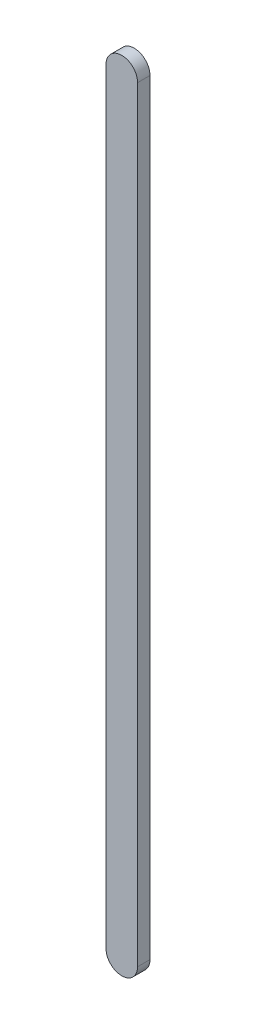
ISO-10303-21;
HEADER;
FILE_DESCRIPTION(('STEP AP214'),'2;1');
FILE_NAME('part.step','',(''),(''),'','','');
FILE_SCHEMA(('AUTOMOTIVE_DESIGN { 1 0 10303 214 1 1 1 1 }'));
ENDSEC;
DATA;
#1=APPLICATION_CONTEXT('core data for automotive mechanical design processes');
#2=APPLICATION_PROTOCOL_DEFINITION('international standard','automotive_design',2000,#1);
#3=PRODUCT_CONTEXT('',#1,'mechanical');
#4=PRODUCT('Part','Part','',(#3));
#5=PRODUCT_RELATED_PRODUCT_CATEGORY('part','',(#4));
#6=PRODUCT_DEFINITION_FORMATION('','',#4);
#7=PRODUCT_DEFINITION_CONTEXT('part definition',#1,'design');
#8=PRODUCT_DEFINITION('design','',#6,#7);
#9=PRODUCT_DEFINITION_SHAPE('','',#8);
#10=(LENGTH_UNIT() NAMED_UNIT(*) SI_UNIT(.MILLI.,.METRE.));
#11=(NAMED_UNIT(*) PLANE_ANGLE_UNIT() SI_UNIT($,.RADIAN.));
#12=(NAMED_UNIT(*) SI_UNIT($,.STERADIAN.) SOLID_ANGLE_UNIT());
#13=UNCERTAINTY_MEASURE_WITH_UNIT(LENGTH_MEASURE(1.E-05),#10,'distance_accuracy_value','');
#14=(GEOMETRIC_REPRESENTATION_CONTEXT(3) GLOBAL_UNCERTAINTY_ASSIGNED_CONTEXT((#13)) GLOBAL_UNIT_ASSIGNED_CONTEXT((#10,
#11,#12)) REPRESENTATION_CONTEXT('',''));
#15=CARTESIAN_POINT('',(0.,0.,0.));
#16=DIRECTION('',(0.,0.,1.));
#17=DIRECTION('',(1.,0.,0.));
#18=AXIS2_PLACEMENT_3D('',#15,#16,#17);
#19=CARTESIAN_POINT('',(102.108,101.4700028,0.));
#20=DIRECTION('',(-1.,0.,0.));
#21=DIRECTION('',(0.,1.,0.));
#22=AXIS2_PLACEMENT_3D('',#19,#20,#21);
#23=PLANE('',#22);
#24=DIRECTION('',(0.,1.,0.));
#25=VECTOR('',#24,1.);
#26=CARTESIAN_POINT('',(102.108,101.4700028,0.1999996));
#27=LINE('',#26,#25);
#28=CARTESIAN_POINT('',(102.108,101.4700028,0.1999996));
#29=VERTEX_POINT('',#28);
#30=CARTESIAN_POINT('',(102.108,113.795048,0.1999996));
#31=VERTEX_POINT('',#30);
#32=EDGE_CURVE('E11',#29,#31,#27,.T.);
#33=ORIENTED_EDGE('',*,*,#32,.F.);
#34=DIRECTION('',(0.,0.,1.));
#35=VECTOR('',#34,1.);
#36=CARTESIAN_POINT('',(102.108,101.4700028,0.));
#37=LINE('',#36,#35);
#38=CARTESIAN_POINT('',(102.108,101.4700028,0.));
#39=VERTEX_POINT('',#38);
#40=EDGE_CURVE('E24',#39,#29,#37,.T.);
#41=ORIENTED_EDGE('',*,*,#40,.F.);
#42=DIRECTION('',(0.,1.,0.));
#43=VECTOR('',#42,1.);
#44=CARTESIAN_POINT('',(102.108,101.4700028,0.));
#45=LINE('',#44,#43);
#46=CARTESIAN_POINT('',(102.108,113.795048,0.));
#47=VERTEX_POINT('',#46);
#48=EDGE_CURVE('E75',#39,#47,#45,.T.);
#49=ORIENTED_EDGE('',*,*,#48,.T.);
#50=DIRECTION('',(0.,0.,1.));
#51=VECTOR('',#50,1.);
#52=CARTESIAN_POINT('',(102.108,113.795048,0.));
#53=LINE('',#52,#51);
#54=EDGE_CURVE('E37',#47,#31,#53,.T.);
#55=ORIENTED_EDGE('',*,*,#54,.T.);
#56=EDGE_LOOP('',(#33,#41,#49,#55));
#57=FACE_BOUND('',#56,.T.);
#58=ADVANCED_FACE('F17',(#57),#23,.F.);
#59=CARTESIAN_POINT('',(101.854,113.795048,0.));
#60=DIRECTION('',(0.,0.,-1.));
#61=DIRECTION('',(1.,0.,0.));
#62=AXIS2_PLACEMENT_3D('',#59,#60,#61);
#63=CYLINDRICAL_SURFACE('',#62,0.254000000000005);
#64=CARTESIAN_POINT('',(101.854,113.795048,0.1999996));
#65=DIRECTION('',(0.,0.,1.));
#66=DIRECTION('',(1.,0.,0.));
#67=AXIS2_PLACEMENT_3D('',#64,#65,#66);
#68=CIRCLE('',#67,0.254000000000005);
#69=CARTESIAN_POINT('',(101.6,113.795048,0.1999996));
#70=VERTEX_POINT('',#69);
#71=EDGE_CURVE('E83',#31,#70,#68,.T.);
#72=ORIENTED_EDGE('',*,*,#71,.F.);
#73=ORIENTED_EDGE('',*,*,#54,.F.);
#74=CARTESIAN_POINT('',(101.854,113.795048,0.));
#75=DIRECTION('',(0.,0.,1.));
#76=DIRECTION('',(1.,0.,0.));
#77=AXIS2_PLACEMENT_3D('',#74,#75,#76);
#78=CIRCLE('',#77,0.254000000000005);
#79=CARTESIAN_POINT('',(101.6,113.795048,0.));
#80=VERTEX_POINT('',#79);
#81=EDGE_CURVE('E81',#47,#80,#78,.T.);
#82=ORIENTED_EDGE('',*,*,#81,.T.);
#83=DIRECTION('',(0.,0.,1.));
#84=VECTOR('',#83,1.);
#85=CARTESIAN_POINT('',(101.6,113.795048,0.));
#86=LINE('',#85,#84);
#87=EDGE_CURVE('E67',#80,#70,#86,.T.);
#88=ORIENTED_EDGE('',*,*,#87,.T.);
#89=EDGE_LOOP('',(#72,#73,#82,#88));
#90=FACE_BOUND('',#89,.T.);
#91=ADVANCED_FACE('F89',(#90),#63,.T.);
#92=CARTESIAN_POINT('',(101.6,113.795048,0.));
#93=DIRECTION('',(1.,0.,0.));
#94=DIRECTION('',(0.,-1.,0.));
#95=AXIS2_PLACEMENT_3D('',#92,#93,#94);
#96=PLANE('',#95);
#97=DIRECTION('',(0.,-1.,0.));
#98=VECTOR('',#97,1.);
#99=CARTESIAN_POINT('',(101.6,113.795048,0.1999996));
#100=LINE('',#99,#98);
#101=CARTESIAN_POINT('',(101.6,101.4700028,0.1999996));
#102=VERTEX_POINT('',#101);
#103=EDGE_CURVE('E71',#70,#102,#100,.T.);
#104=ORIENTED_EDGE('',*,*,#103,.F.);
#105=ORIENTED_EDGE('',*,*,#87,.F.);
#106=DIRECTION('',(0.,-1.,0.));
#107=VECTOR('',#106,1.);
#108=CARTESIAN_POINT('',(101.6,113.795048,0.));
#109=LINE('',#108,#107);
#110=CARTESIAN_POINT('',(101.6,101.4700028,0.));
#111=VERTEX_POINT('',#110);
#112=EDGE_CURVE('E63',#80,#111,#109,.T.);
#113=ORIENTED_EDGE('',*,*,#112,.T.);
#114=DIRECTION('',(0.,0.,1.));
#115=VECTOR('',#114,1.);
#116=CARTESIAN_POINT('',(101.6,101.4700028,0.));
#117=LINE('',#116,#115);
#118=EDGE_CURVE('E53',#111,#102,#117,.T.);
#119=ORIENTED_EDGE('',*,*,#118,.T.);
#120=EDGE_LOOP('',(#104,#105,#113,#119));
#121=FACE_BOUND('',#120,.T.);
#122=ADVANCED_FACE('F66',(#121),#96,.F.);
#123=CARTESIAN_POINT('',(101.854,101.4700028,0.));
#124=DIRECTION('',(0.,0.,-1.));
#125=DIRECTION('',(-1.,0.,0.));
#126=AXIS2_PLACEMENT_3D('',#123,#124,#125);
#127=CYLINDRICAL_SURFACE('',#126,0.254000000000005);
#128=CARTESIAN_POINT('',(101.854,101.4700028,0.1999996));
#129=DIRECTION('',(0.,0.,1.));
#130=DIRECTION('',(-1.,0.,0.));
#131=AXIS2_PLACEMENT_3D('',#128,#129,#130);
#132=CIRCLE('',#131,0.254000000000005);
#133=EDGE_CURVE('E59',#102,#29,#132,.T.);
#134=ORIENTED_EDGE('',*,*,#133,.F.);
#135=ORIENTED_EDGE('',*,*,#118,.F.);
#136=CARTESIAN_POINT('',(101.854,101.4700028,0.));
#137=DIRECTION('',(0.,0.,1.));
#138=DIRECTION('',(-1.,0.,0.));
#139=AXIS2_PLACEMENT_3D('',#136,#137,#138);
#140=CIRCLE('',#139,0.254000000000005);
#141=EDGE_CURVE('E57',#111,#39,#140,.T.);
#142=ORIENTED_EDGE('',*,*,#141,.T.);
#143=ORIENTED_EDGE('',*,*,#40,.T.);
#144=EDGE_LOOP('',(#134,#135,#142,#143));
#145=FACE_BOUND('',#144,.T.);
#146=ADVANCED_FACE('F55',(#145),#127,.T.);
#147=CARTESIAN_POINT('',(102.108,101.4700028,0.));
#148=DIRECTION('',(0.,0.,-1.));
#149=DIRECTION('',(-1.,0.,0.));
#150=AXIS2_PLACEMENT_3D('',#147,#148,#149);
#151=PLANE('',#150);
#152=ORIENTED_EDGE('',*,*,#141,.F.);
#153=ORIENTED_EDGE('',*,*,#112,.F.);
#154=ORIENTED_EDGE('',*,*,#81,.F.);
#155=ORIENTED_EDGE('',*,*,#48,.F.);
#156=EDGE_LOOP('',(#152,#153,#154,#155));
#157=FACE_BOUND('',#156,.T.);
#158=ADVANCED_FACE('F74',(#157),#151,.T.);
#159=CARTESIAN_POINT('',(102.108,101.4700028,0.1999996));
#160=DIRECTION('',(0.,0.,-1.));
#161=DIRECTION('',(-1.,0.,0.));
#162=AXIS2_PLACEMENT_3D('',#159,#160,#161);
#163=PLANE('',#162);
#164=ORIENTED_EDGE('',*,*,#32,.T.);
#165=ORIENTED_EDGE('',*,*,#71,.T.);
#166=ORIENTED_EDGE('',*,*,#103,.T.);
#167=ORIENTED_EDGE('',*,*,#133,.T.);
#168=EDGE_LOOP('',(#164,#165,#166,#167));
#169=FACE_BOUND('',#168,.T.);
#170=ADVANCED_FACE('F91',(#169),#163,.F.);
#171=CLOSED_SHELL('',(#58,#91,#122,#146,#158,#170));
#172=MANIFOLD_SOLID_BREP('B1',#171);
#173=ADVANCED_BREP_SHAPE_REPRESENTATION('',(#18,#172),#14);
#174=SHAPE_DEFINITION_REPRESENTATION(#9,#173);
ENDSEC;
END-ISO-10303-21;
